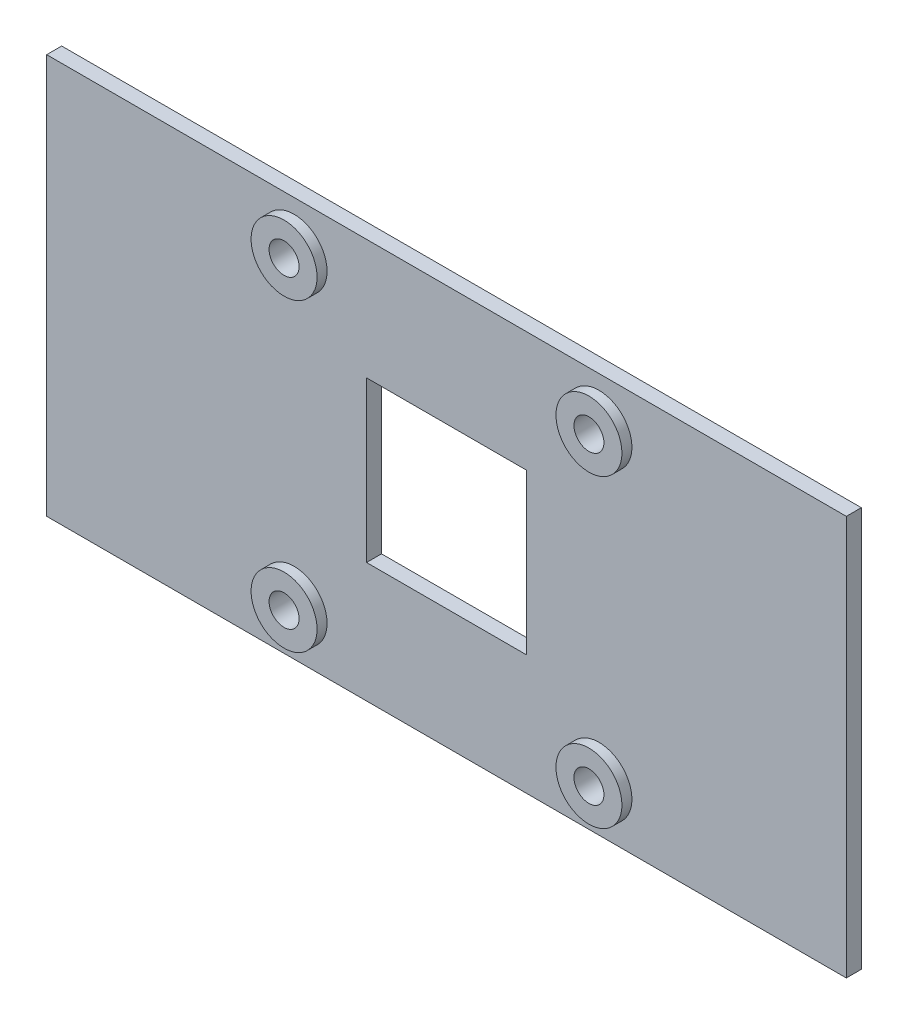
ISO-10303-21;
HEADER;
FILE_DESCRIPTION(('STEP AP214'),'2;1');
FILE_NAME('part.step','',(''),(''),'','','');
FILE_SCHEMA(('AUTOMOTIVE_DESIGN { 1 0 10303 214 1 1 1 1 }'));
ENDSEC;
DATA;
#1=APPLICATION_CONTEXT('core data for automotive mechanical design processes');
#2=APPLICATION_PROTOCOL_DEFINITION('international standard','automotive_design',2000,#1);
#3=PRODUCT_CONTEXT('',#1,'mechanical');
#4=PRODUCT('Part','Part','',(#3));
#5=PRODUCT_RELATED_PRODUCT_CATEGORY('part','',(#4));
#6=PRODUCT_DEFINITION_FORMATION('','',#4);
#7=PRODUCT_DEFINITION_CONTEXT('part definition',#1,'design');
#8=PRODUCT_DEFINITION('design','',#6,#7);
#9=PRODUCT_DEFINITION_SHAPE('','',#8);
#10=(LENGTH_UNIT() NAMED_UNIT(*) SI_UNIT(.MILLI.,.METRE.));
#11=(NAMED_UNIT(*) PLANE_ANGLE_UNIT() SI_UNIT($,.RADIAN.));
#12=(NAMED_UNIT(*) SI_UNIT($,.STERADIAN.) SOLID_ANGLE_UNIT());
#13=UNCERTAINTY_MEASURE_WITH_UNIT(LENGTH_MEASURE(1.E-05),#10,'distance_accuracy_value','');
#14=(GEOMETRIC_REPRESENTATION_CONTEXT(3) GLOBAL_UNCERTAINTY_ASSIGNED_CONTEXT((#13)) GLOBAL_UNIT_ASSIGNED_CONTEXT((#10,
#11,#12)) REPRESENTATION_CONTEXT('',''));
#15=CARTESIAN_POINT('',(0.,0.,0.));
#16=DIRECTION('',(0.,0.,1.));
#17=DIRECTION('',(1.,0.,0.));
#18=AXIS2_PLACEMENT_3D('',#15,#16,#17);
#19=CARTESIAN_POINT('',(0.,0.,1.5));
#20=DIRECTION('',(0.,0.,1.));
#21=DIRECTION('',(1.,0.,0.));
#22=AXIS2_PLACEMENT_3D('',#19,#20,#21);
#23=PLANE('',#22);
#24=CARTESIAN_POINT('',(-22.4791463831349,-14.9932103921682,1.5));
#25=DIRECTION('',(0.,0.,1.));
#26=DIRECTION('',(1.,0.,0.));
#27=AXIS2_PLACEMENT_3D('',#24,#25,#26);
#28=CIRCLE('',#27,3.3);
#29=CARTESIAN_POINT('',(-19.1791463831349,-14.9932103921682,1.5));
#30=VERTEX_POINT('',#29);
#31=EDGE_CURVE('E294',#30,#30,#28,.T.);
#32=ORIENTED_EDGE('',*,*,#31,.F.);
#33=EDGE_LOOP('',(#32));
#34=FACE_BOUND('',#33,.T.);
#35=CARTESIAN_POINT('',(-22.4791463831349,15.5067896078318,1.5));
#36=DIRECTION('',(0.,0.,1.));
#37=DIRECTION('',(1.,0.,0.));
#38=AXIS2_PLACEMENT_3D('',#35,#36,#37);
#39=CIRCLE('',#38,3.3);
#40=CARTESIAN_POINT('',(-19.1791463831349,15.5067896078318,1.5));
#41=VERTEX_POINT('',#40);
#42=EDGE_CURVE('E238',#41,#41,#39,.T.);
#43=ORIENTED_EDGE('',*,*,#42,.F.);
#44=EDGE_LOOP('',(#43));
#45=FACE_BOUND('',#44,.T.);
#46=DIRECTION('',(0.,-1.,0.));
#47=VECTOR('',#46,1.);
#48=CARTESIAN_POINT('',(-47.2291463831347,20.2567896078318,1.5));
#49=LINE('',#48,#47);
#50=CARTESIAN_POINT('',(-47.2291463831347,20.2567896078318,1.5));
#51=VERTEX_POINT('',#50);
#52=CARTESIAN_POINT('',(-47.2291463831347,-19.7432103921682,1.5));
#53=VERTEX_POINT('',#52);
#54=EDGE_CURVE('E155',#51,#53,#49,.T.);
#55=ORIENTED_EDGE('',*,*,#54,.T.);
#56=DIRECTION('',(1.,0.,0.));
#57=VECTOR('',#56,1.);
#58=CARTESIAN_POINT('',(-47.2291463831347,-19.7432103921682,1.5));
#59=LINE('',#58,#57);
#60=CARTESIAN_POINT('',(32.7708536168649,-19.7432103921682,1.5));
#61=VERTEX_POINT('',#60);
#62=EDGE_CURVE('E158',#53,#61,#59,.T.);
#63=ORIENTED_EDGE('',*,*,#62,.T.);
#64=DIRECTION('',(0.,1.,0.));
#65=VECTOR('',#64,1.);
#66=CARTESIAN_POINT('',(32.7708536168649,20.2567896078318,1.5));
#67=LINE('',#66,#65);
#68=CARTESIAN_POINT('',(32.7708536168649,20.2567896078318,1.5));
#69=VERTEX_POINT('',#68);
#70=EDGE_CURVE('E161',#61,#69,#67,.T.);
#71=ORIENTED_EDGE('',*,*,#70,.T.);
#72=DIRECTION('',(-1.,0.,0.));
#73=VECTOR('',#72,1.);
#74=CARTESIAN_POINT('',(-47.2291463831347,20.2567896078318,1.5));
#75=LINE('',#74,#73);
#76=EDGE_CURVE('E163',#69,#51,#75,.T.);
#77=ORIENTED_EDGE('',*,*,#76,.T.);
#78=EDGE_LOOP('',(#55,#63,#71,#77));
#79=FACE_BOUND('',#78,.T.);
#80=DIRECTION('',(0.,1.,0.));
#81=VECTOR('',#80,1.);
#82=CARTESIAN_POINT('',(0.770853616865096,-7.74321039216817,1.5));
#83=LINE('',#82,#81);
#84=CARTESIAN_POINT('',(0.770853616865096,-7.74321039216817,1.5));
#85=VERTEX_POINT('',#84);
#86=CARTESIAN_POINT('',(0.770853616865096,8.25678960783183,1.5));
#87=VERTEX_POINT('',#86);
#88=EDGE_CURVE('E110',#85,#87,#83,.T.);
#89=ORIENTED_EDGE('',*,*,#88,.F.);
#90=DIRECTION('',(1.,0.,0.));
#91=VECTOR('',#90,1.);
#92=CARTESIAN_POINT('',(-15.2291463831349,-7.74321039216817,1.5));
#93=LINE('',#92,#91);
#94=CARTESIAN_POINT('',(-15.2291463831349,-7.74321039216817,1.5));
#95=VERTEX_POINT('',#94);
#96=EDGE_CURVE('E102',#95,#85,#93,.T.);
#97=ORIENTED_EDGE('',*,*,#96,.F.);
#98=DIRECTION('',(0.,-1.,0.));
#99=VECTOR('',#98,1.);
#100=CARTESIAN_POINT('',(-15.2291463831349,8.25678960783183,1.5));
#101=LINE('',#100,#99);
#102=CARTESIAN_POINT('',(-15.2291463831349,8.25678960783183,1.5));
#103=VERTEX_POINT('',#102);
#104=EDGE_CURVE('E126',#103,#95,#101,.T.);
#105=ORIENTED_EDGE('',*,*,#104,.F.);
#106=DIRECTION('',(-1.,0.,0.));
#107=VECTOR('',#106,1.);
#108=CARTESIAN_POINT('',(0.770853616865096,8.25678960783183,1.5));
#109=LINE('',#108,#107);
#110=EDGE_CURVE('E124',#87,#103,#109,.T.);
#111=ORIENTED_EDGE('',*,*,#110,.F.);
#112=EDGE_LOOP('',(#89,#97,#105,#111));
#113=FACE_BOUND('',#112,.T.);
#114=CARTESIAN_POINT('',(8.02085361686509,-14.9932103921682,1.5));
#115=DIRECTION('',(0.,0.,1.));
#116=DIRECTION('',(1.,0.,0.));
#117=AXIS2_PLACEMENT_3D('',#114,#115,#116);
#118=CIRCLE('',#117,3.3);
#119=CARTESIAN_POINT('',(11.3208536168651,-14.9932103921682,1.5));
#120=VERTEX_POINT('',#119);
#121=EDGE_CURVE('E291',#120,#120,#118,.T.);
#122=ORIENTED_EDGE('',*,*,#121,.F.);
#123=EDGE_LOOP('',(#122));
#124=FACE_BOUND('',#123,.T.);
#125=CARTESIAN_POINT('',(8.02085361686509,15.5067896078318,1.5));
#126=DIRECTION('',(0.,0.,1.));
#127=DIRECTION('',(1.,0.,0.));
#128=AXIS2_PLACEMENT_3D('',#125,#126,#127);
#129=CIRCLE('',#128,3.3);
#130=CARTESIAN_POINT('',(11.3208536168651,15.5067896078318,1.5));
#131=VERTEX_POINT('',#130);
#132=EDGE_CURVE('E243',#131,#131,#129,.T.);
#133=ORIENTED_EDGE('',*,*,#132,.F.);
#134=EDGE_LOOP('',(#133));
#135=FACE_BOUND('',#134,.T.);
#136=ADVANCED_FACE('F39',(#34,#45,#79,#113,#124,#135),#23,.T.);
#137=CARTESIAN_POINT('',(0.,0.,0.));
#138=DIRECTION('',(0.,0.,1.));
#139=DIRECTION('',(1.,0.,0.));
#140=AXIS2_PLACEMENT_3D('',#137,#138,#139);
#141=PLANE('',#140);
#142=CARTESIAN_POINT('',(-22.4791463831349,-14.9932103921682,0.));
#143=DIRECTION('',(0.,0.,1.));
#144=DIRECTION('',(-1.,0.,0.));
#145=AXIS2_PLACEMENT_3D('',#142,#143,#144);
#146=CIRCLE('',#145,1.5);
#147=CARTESIAN_POINT('',(-23.9791463831349,-14.9932103921682,0.));
#148=VERTEX_POINT('',#147);
#149=EDGE_CURVE('E119',#148,#148,#146,.T.);
#150=ORIENTED_EDGE('',*,*,#149,.T.);
#151=EDGE_LOOP('',(#150));
#152=FACE_BOUND('',#151,.T.);
#153=CARTESIAN_POINT('',(8.02085361686509,-14.9932103921682,0.));
#154=DIRECTION('',(0.,0.,1.));
#155=DIRECTION('',(1.,0.,0.));
#156=AXIS2_PLACEMENT_3D('',#153,#154,#155);
#157=CIRCLE('',#156,1.5);
#158=CARTESIAN_POINT('',(9.52085361686509,-14.9932103921682,0.));
#159=VERTEX_POINT('',#158);
#160=EDGE_CURVE('E145',#159,#159,#157,.T.);
#161=ORIENTED_EDGE('',*,*,#160,.T.);
#162=EDGE_LOOP('',(#161));
#163=FACE_BOUND('',#162,.T.);
#164=CARTESIAN_POINT('',(8.02085361686509,15.5067896078318,0.));
#165=DIRECTION('',(0.,0.,1.));
#166=DIRECTION('',(-1.,0.,0.));
#167=AXIS2_PLACEMENT_3D('',#164,#165,#166);
#168=CIRCLE('',#167,1.5);
#169=CARTESIAN_POINT('',(6.52085361686509,15.5067896078318,0.));
#170=VERTEX_POINT('',#169);
#171=EDGE_CURVE('E148',#170,#170,#168,.T.);
#172=ORIENTED_EDGE('',*,*,#171,.T.);
#173=EDGE_LOOP('',(#172));
#174=FACE_BOUND('',#173,.T.);
#175=CARTESIAN_POINT('',(-22.4791463831349,15.5067896078318,0.));
#176=DIRECTION('',(0.,0.,1.));
#177=DIRECTION('',(1.,0.,0.));
#178=AXIS2_PLACEMENT_3D('',#175,#176,#177);
#179=CIRCLE('',#178,1.5);
#180=CARTESIAN_POINT('',(-20.9791463831349,15.5067896078318,0.));
#181=VERTEX_POINT('',#180);
#182=EDGE_CURVE('E151',#181,#181,#179,.T.);
#183=ORIENTED_EDGE('',*,*,#182,.T.);
#184=EDGE_LOOP('',(#183));
#185=FACE_BOUND('',#184,.T.);
#186=DIRECTION('',(0.,-1.,0.));
#187=VECTOR('',#186,1.);
#188=CARTESIAN_POINT('',(-47.2291463831347,20.2567896078318,0.));
#189=LINE('',#188,#187);
#190=CARTESIAN_POINT('',(-47.2291463831347,20.2567896078318,0.));
#191=VERTEX_POINT('',#190);
#192=CARTESIAN_POINT('',(-47.2291463831347,-19.7432103921682,0.));
#193=VERTEX_POINT('',#192);
#194=EDGE_CURVE('E154',#191,#193,#189,.T.);
#195=ORIENTED_EDGE('',*,*,#194,.F.);
#196=DIRECTION('',(-1.,0.,0.));
#197=VECTOR('',#196,1.);
#198=CARTESIAN_POINT('',(-47.2291463831347,20.2567896078318,0.));
#199=LINE('',#198,#197);
#200=CARTESIAN_POINT('',(32.7708536168649,20.2567896078318,0.));
#201=VERTEX_POINT('',#200);
#202=EDGE_CURVE('E159',#201,#191,#199,.T.);
#203=ORIENTED_EDGE('',*,*,#202,.F.);
#204=DIRECTION('',(0.,1.,0.));
#205=VECTOR('',#204,1.);
#206=CARTESIAN_POINT('',(32.7708536168649,20.2567896078318,0.));
#207=LINE('',#206,#205);
#208=CARTESIAN_POINT('',(32.7708536168649,-19.7432103921682,0.));
#209=VERTEX_POINT('',#208);
#210=EDGE_CURVE('E170',#209,#201,#207,.T.);
#211=ORIENTED_EDGE('',*,*,#210,.F.);
#212=DIRECTION('',(1.,0.,0.));
#213=VECTOR('',#212,1.);
#214=CARTESIAN_POINT('',(-47.2291463831347,-19.7432103921682,0.));
#215=LINE('',#214,#213);
#216=EDGE_CURVE('E168',#193,#209,#215,.T.);
#217=ORIENTED_EDGE('',*,*,#216,.F.);
#218=EDGE_LOOP('',(#195,#203,#211,#217));
#219=FACE_BOUND('',#218,.T.);
#220=DIRECTION('',(1.,0.,0.));
#221=VECTOR('',#220,1.);
#222=CARTESIAN_POINT('',(-7.2291463831349,-7.74321039216817,0.));
#223=LINE('',#222,#221);
#224=CARTESIAN_POINT('',(-15.2291463831349,-7.74321039216817,0.));
#225=VERTEX_POINT('',#224);
#226=CARTESIAN_POINT('',(0.770853616865096,-7.74321039216817,0.));
#227=VERTEX_POINT('',#226);
#228=EDGE_CURVE('E131',#225,#227,#223,.T.);
#229=ORIENTED_EDGE('',*,*,#228,.T.);
#230=DIRECTION('',(0.,1.,0.));
#231=VECTOR('',#230,1.);
#232=CARTESIAN_POINT('',(0.770853616865096,-7.74321039216817,0.));
#233=LINE('',#232,#231);
#234=CARTESIAN_POINT('',(0.770853616865096,8.25678960783183,0.));
#235=VERTEX_POINT('',#234);
#236=EDGE_CURVE('E117',#227,#235,#233,.T.);
#237=ORIENTED_EDGE('',*,*,#236,.T.);
#238=DIRECTION('',(-1.,0.,0.));
#239=VECTOR('',#238,1.);
#240=CARTESIAN_POINT('',(0.770853616865096,8.25678960783183,0.));
#241=LINE('',#240,#239);
#242=CARTESIAN_POINT('',(-15.2291463831349,8.25678960783183,0.));
#243=VERTEX_POINT('',#242);
#244=EDGE_CURVE('E135',#235,#243,#241,.T.);
#245=ORIENTED_EDGE('',*,*,#244,.T.);
#246=DIRECTION('',(0.,-1.,0.));
#247=VECTOR('',#246,1.);
#248=CARTESIAN_POINT('',(-15.2291463831349,8.25678960783183,0.));
#249=LINE('',#248,#247);
#250=EDGE_CURVE('E111',#243,#225,#249,.T.);
#251=ORIENTED_EDGE('',*,*,#250,.T.);
#252=EDGE_LOOP('',(#229,#237,#245,#251));
#253=FACE_BOUND('',#252,.T.);
#254=ADVANCED_FACE('F188',(#152,#163,#174,#185,#219,#253),#141,.F.);
#255=CARTESIAN_POINT('',(-47.2291463831347,20.2567896078318,1.5));
#256=DIRECTION('',(1.,0.,0.));
#257=DIRECTION('',(0.,1.,0.));
#258=AXIS2_PLACEMENT_3D('',#255,#256,#257);
#259=PLANE('',#258);
#260=ORIENTED_EDGE('',*,*,#194,.T.);
#261=DIRECTION('',(0.,0.,-1.));
#262=VECTOR('',#261,1.);
#263=CARTESIAN_POINT('',(-47.2291463831347,-19.7432103921682,1.5));
#264=LINE('',#263,#262);
#265=EDGE_CURVE('E11',#53,#193,#264,.T.);
#266=ORIENTED_EDGE('',*,*,#265,.F.);
#267=ORIENTED_EDGE('',*,*,#54,.F.);
#268=DIRECTION('',(0.,0.,-1.));
#269=VECTOR('',#268,1.);
#270=CARTESIAN_POINT('',(-47.2291463831347,20.2567896078318,1.5));
#271=LINE('',#270,#269);
#272=EDGE_CURVE('E165',#51,#191,#271,.T.);
#273=ORIENTED_EDGE('',*,*,#272,.T.);
#274=EDGE_LOOP('',(#260,#266,#267,#273));
#275=FACE_BOUND('',#274,.T.);
#276=ADVANCED_FACE('F41',(#275),#259,.F.);
#277=CARTESIAN_POINT('',(-47.2291463831347,-19.7432103921682,1.5));
#278=DIRECTION('',(0.,1.,0.));
#279=DIRECTION('',(-1.,0.,0.));
#280=AXIS2_PLACEMENT_3D('',#277,#278,#279);
#281=PLANE('',#280);
#282=ORIENTED_EDGE('',*,*,#216,.T.);
#283=DIRECTION('',(0.,0.,-1.));
#284=VECTOR('',#283,1.);
#285=CARTESIAN_POINT('',(32.7708536168649,-19.7432103921682,1.5));
#286=LINE('',#285,#284);
#287=EDGE_CURVE('E47',#61,#209,#286,.T.);
#288=ORIENTED_EDGE('',*,*,#287,.F.);
#289=ORIENTED_EDGE('',*,*,#62,.F.);
#290=ORIENTED_EDGE('',*,*,#265,.T.);
#291=EDGE_LOOP('',(#282,#288,#289,#290));
#292=FACE_BOUND('',#291,.T.);
#293=ADVANCED_FACE('F198',(#292),#281,.F.);
#294=CARTESIAN_POINT('',(32.7708536168649,20.2567896078318,1.5));
#295=DIRECTION('',(-1.,0.,0.));
#296=DIRECTION('',(0.,0.,1.));
#297=AXIS2_PLACEMENT_3D('',#294,#295,#296);
#298=PLANE('',#297);
#299=ORIENTED_EDGE('',*,*,#210,.T.);
#300=DIRECTION('',(0.,0.,-1.));
#301=VECTOR('',#300,1.);
#302=CARTESIAN_POINT('',(32.7708536168649,20.2567896078318,1.5));
#303=LINE('',#302,#301);
#304=EDGE_CURVE('E175',#69,#201,#303,.T.);
#305=ORIENTED_EDGE('',*,*,#304,.F.);
#306=ORIENTED_EDGE('',*,*,#70,.F.);
#307=ORIENTED_EDGE('',*,*,#287,.T.);
#308=EDGE_LOOP('',(#299,#305,#306,#307));
#309=FACE_BOUND('',#308,.T.);
#310=ADVANCED_FACE('F182',(#309),#298,.F.);
#311=CARTESIAN_POINT('',(-47.2291463831347,20.2567896078318,1.5));
#312=DIRECTION('',(0.,-1.,0.));
#313=DIRECTION('',(1.,0.,0.));
#314=AXIS2_PLACEMENT_3D('',#311,#312,#313);
#315=PLANE('',#314);
#316=ORIENTED_EDGE('',*,*,#202,.T.);
#317=ORIENTED_EDGE('',*,*,#272,.F.);
#318=ORIENTED_EDGE('',*,*,#76,.F.);
#319=ORIENTED_EDGE('',*,*,#304,.T.);
#320=EDGE_LOOP('',(#316,#317,#318,#319));
#321=FACE_BOUND('',#320,.T.);
#322=ADVANCED_FACE('F192',(#321),#315,.F.);
#323=CARTESIAN_POINT('',(-22.4791463831349,15.5067896078318,1.5));
#324=DIRECTION('',(0.,0.,-1.));
#325=DIRECTION('',(-1.,0.,0.));
#326=AXIS2_PLACEMENT_3D('',#323,#324,#325);
#327=CYLINDRICAL_SURFACE('',#326,1.5);
#328=ORIENTED_EDGE('',*,*,#182,.F.);
#329=EDGE_LOOP('',(#328));
#330=FACE_BOUND('',#329,.T.);
#331=CARTESIAN_POINT('',(-22.4791463831349,15.5067896078318,2.5));
#332=DIRECTION('',(0.,0.,1.));
#333=DIRECTION('',(1.,0.,0.));
#334=AXIS2_PLACEMENT_3D('',#331,#332,#333);
#335=CIRCLE('',#334,1.5);
#336=CARTESIAN_POINT('',(-20.9791463831349,15.5067896078318,2.5));
#337=VERTEX_POINT('',#336);
#338=EDGE_CURVE('E236',#337,#337,#335,.T.);
#339=ORIENTED_EDGE('',*,*,#338,.T.);
#340=EDGE_LOOP('',(#339));
#341=FACE_BOUND('',#340,.T.);
#342=ADVANCED_FACE('F218',(#330,#341),#327,.F.);
#343=CARTESIAN_POINT('',(8.02085361686509,15.5067896078318,1.5));
#344=DIRECTION('',(0.,0.,-1.));
#345=DIRECTION('',(-1.,0.,0.));
#346=AXIS2_PLACEMENT_3D('',#343,#344,#345);
#347=CYLINDRICAL_SURFACE('',#346,1.5);
#348=ORIENTED_EDGE('',*,*,#171,.F.);
#349=EDGE_LOOP('',(#348));
#350=FACE_BOUND('',#349,.T.);
#351=CARTESIAN_POINT('',(8.02085361686509,15.5067896078318,2.5));
#352=DIRECTION('',(0.,0.,1.));
#353=DIRECTION('',(1.,0.,0.));
#354=AXIS2_PLACEMENT_3D('',#351,#352,#353);
#355=CIRCLE('',#354,1.5);
#356=CARTESIAN_POINT('',(9.52085361686509,15.5067896078318,2.5));
#357=VERTEX_POINT('',#356);
#358=EDGE_CURVE('E239',#357,#357,#355,.T.);
#359=ORIENTED_EDGE('',*,*,#358,.T.);
#360=EDGE_LOOP('',(#359));
#361=FACE_BOUND('',#360,.T.);
#362=ADVANCED_FACE('F225',(#350,#361),#347,.F.);
#363=CARTESIAN_POINT('',(8.02085361686509,-14.9932103921682,1.5));
#364=DIRECTION('',(0.,0.,-1.));
#365=DIRECTION('',(-1.,0.,0.));
#366=AXIS2_PLACEMENT_3D('',#363,#364,#365);
#367=CYLINDRICAL_SURFACE('',#366,1.5);
#368=ORIENTED_EDGE('',*,*,#160,.F.);
#369=EDGE_LOOP('',(#368));
#370=FACE_BOUND('',#369,.T.);
#371=CARTESIAN_POINT('',(8.02085361686509,-14.9932103921682,2.5));
#372=DIRECTION('',(0.,0.,1.));
#373=DIRECTION('',(1.,0.,0.));
#374=AXIS2_PLACEMENT_3D('',#371,#372,#373);
#375=CIRCLE('',#374,1.5);
#376=CARTESIAN_POINT('',(9.52085361686509,-14.9932103921682,2.5));
#377=VERTEX_POINT('',#376);
#378=EDGE_CURVE('E288',#377,#377,#375,.T.);
#379=ORIENTED_EDGE('',*,*,#378,.T.);
#380=EDGE_LOOP('',(#379));
#381=FACE_BOUND('',#380,.T.);
#382=ADVANCED_FACE('F230',(#370,#381),#367,.F.);
#383=CARTESIAN_POINT('',(-22.4791463831349,-14.9932103921682,1.5));
#384=DIRECTION('',(0.,0.,-1.));
#385=DIRECTION('',(-1.,0.,0.));
#386=AXIS2_PLACEMENT_3D('',#383,#384,#385);
#387=CYLINDRICAL_SURFACE('',#386,1.5);
#388=ORIENTED_EDGE('',*,*,#149,.F.);
#389=EDGE_LOOP('',(#388));
#390=FACE_BOUND('',#389,.T.);
#391=CARTESIAN_POINT('',(-22.4791463831349,-14.9932103921682,2.5));
#392=DIRECTION('',(0.,0.,1.));
#393=DIRECTION('',(1.,0.,0.));
#394=AXIS2_PLACEMENT_3D('',#391,#392,#393);
#395=CIRCLE('',#394,1.5);
#396=CARTESIAN_POINT('',(-20.9791463831349,-14.9932103921682,2.5));
#397=VERTEX_POINT('',#396);
#398=EDGE_CURVE('E247',#397,#397,#395,.T.);
#399=ORIENTED_EDGE('',*,*,#398,.T.);
#400=EDGE_LOOP('',(#399));
#401=FACE_BOUND('',#400,.T.);
#402=ADVANCED_FACE('F276',(#390,#401),#387,.F.);
#403=CARTESIAN_POINT('',(-7.2291463831349,-7.74321039216817,1.5));
#404=DIRECTION('',(0.,1.,0.));
#405=DIRECTION('',(0.,0.,1.));
#406=AXIS2_PLACEMENT_3D('',#403,#404,#405);
#407=PLANE('',#406);
#408=ORIENTED_EDGE('',*,*,#228,.F.);
#409=DIRECTION('',(0.,0.,-1.));
#410=VECTOR('',#409,1.);
#411=CARTESIAN_POINT('',(-15.2291463831349,-7.74321039216817,1.5));
#412=LINE('',#411,#410);
#413=EDGE_CURVE('E59',#95,#225,#412,.T.);
#414=ORIENTED_EDGE('',*,*,#413,.F.);
#415=ORIENTED_EDGE('',*,*,#96,.T.);
#416=DIRECTION('',(0.,0.,-1.));
#417=VECTOR('',#416,1.);
#418=CARTESIAN_POINT('',(0.770853616865096,-7.74321039216817,1.5));
#419=LINE('',#418,#417);
#420=EDGE_CURVE('E105',#85,#227,#419,.T.);
#421=ORIENTED_EDGE('',*,*,#420,.T.);
#422=EDGE_LOOP('',(#408,#414,#415,#421));
#423=FACE_BOUND('',#422,.T.);
#424=ADVANCED_FACE('F104',(#423),#407,.T.);
#425=CARTESIAN_POINT('',(0.770853616865096,-7.74321039216817,1.5));
#426=DIRECTION('',(-1.,0.,0.));
#427=DIRECTION('',(0.,0.,1.));
#428=AXIS2_PLACEMENT_3D('',#425,#426,#427);
#429=PLANE('',#428);
#430=ORIENTED_EDGE('',*,*,#236,.F.);
#431=ORIENTED_EDGE('',*,*,#420,.F.);
#432=ORIENTED_EDGE('',*,*,#88,.T.);
#433=DIRECTION('',(0.,0.,-1.));
#434=VECTOR('',#433,1.);
#435=CARTESIAN_POINT('',(0.770853616865096,8.25678960783183,1.5));
#436=LINE('',#435,#434);
#437=EDGE_CURVE('E120',#87,#235,#436,.T.);
#438=ORIENTED_EDGE('',*,*,#437,.T.);
#439=EDGE_LOOP('',(#430,#431,#432,#438));
#440=FACE_BOUND('',#439,.T.);
#441=ADVANCED_FACE('F114',(#440),#429,.T.);
#442=CARTESIAN_POINT('',(0.770853616865096,8.25678960783183,1.5));
#443=DIRECTION('',(0.,-1.,0.));
#444=DIRECTION('',(1.,0.,0.));
#445=AXIS2_PLACEMENT_3D('',#442,#443,#444);
#446=PLANE('',#445);
#447=ORIENTED_EDGE('',*,*,#244,.F.);
#448=ORIENTED_EDGE('',*,*,#437,.F.);
#449=ORIENTED_EDGE('',*,*,#110,.T.);
#450=DIRECTION('',(0.,0.,-1.));
#451=VECTOR('',#450,1.);
#452=CARTESIAN_POINT('',(-15.2291463831349,8.25678960783183,1.5));
#453=LINE('',#452,#451);
#454=EDGE_CURVE('E54',#103,#243,#453,.T.);
#455=ORIENTED_EDGE('',*,*,#454,.T.);
#456=EDGE_LOOP('',(#447,#448,#449,#455));
#457=FACE_BOUND('',#456,.T.);
#458=ADVANCED_FACE('F269',(#457),#446,.T.);
#459=CARTESIAN_POINT('',(-15.2291463831349,8.25678960783183,1.5));
#460=DIRECTION('',(1.,0.,0.));
#461=DIRECTION('',(0.,0.,-1.));
#462=AXIS2_PLACEMENT_3D('',#459,#460,#461);
#463=PLANE('',#462);
#464=ORIENTED_EDGE('',*,*,#250,.F.);
#465=ORIENTED_EDGE('',*,*,#454,.F.);
#466=ORIENTED_EDGE('',*,*,#104,.T.);
#467=ORIENTED_EDGE('',*,*,#413,.T.);
#468=EDGE_LOOP('',(#464,#465,#466,#467));
#469=FACE_BOUND('',#468,.T.);
#470=ADVANCED_FACE('F266',(#469),#463,.T.);
#471=CARTESIAN_POINT('',(-22.4791463831349,-14.9932103921682,2.5));
#472=DIRECTION('',(0.,0.,1.));
#473=DIRECTION('',(1.,0.,0.));
#474=AXIS2_PLACEMENT_3D('',#471,#472,#473);
#475=PLANE('',#474);
#476=CARTESIAN_POINT('',(-22.4791463831349,-14.9932103921682,2.5));
#477=DIRECTION('',(0.,0.,1.));
#478=DIRECTION('',(1.,0.,0.));
#479=AXIS2_PLACEMENT_3D('',#476,#477,#478);
#480=CIRCLE('',#479,3.3);
#481=CARTESIAN_POINT('',(-19.1791463831349,-14.9932103921682,2.5));
#482=VERTEX_POINT('',#481);
#483=EDGE_CURVE('E290',#482,#482,#480,.T.);
#484=ORIENTED_EDGE('',*,*,#483,.T.);
#485=EDGE_LOOP('',(#484));
#486=FACE_BOUND('',#485,.T.);
#487=ORIENTED_EDGE('',*,*,#398,.F.);
#488=EDGE_LOOP('',(#487));
#489=FACE_BOUND('',#488,.T.);
#490=ADVANCED_FACE('F268',(#486,#489),#475,.T.);
#491=CARTESIAN_POINT('',(-22.4791463831349,-14.9932103921682,2.5));
#492=DIRECTION('',(0.,0.,-1.));
#493=DIRECTION('',(-1.,0.,0.));
#494=AXIS2_PLACEMENT_3D('',#491,#492,#493);
#495=CYLINDRICAL_SURFACE('',#494,3.3);
#496=ORIENTED_EDGE('',*,*,#483,.F.);
#497=EDGE_LOOP('',(#496));
#498=FACE_BOUND('',#497,.T.);
#499=ORIENTED_EDGE('',*,*,#31,.T.);
#500=EDGE_LOOP('',(#499));
#501=FACE_BOUND('',#500,.T.);
#502=ADVANCED_FACE('F312',(#498,#501),#495,.T.);
#503=CARTESIAN_POINT('',(8.02085361686509,-14.9932103921682,2.5));
#504=DIRECTION('',(0.,0.,1.));
#505=DIRECTION('',(1.,0.,0.));
#506=AXIS2_PLACEMENT_3D('',#503,#504,#505);
#507=PLANE('',#506);
#508=CARTESIAN_POINT('',(8.02085361686509,-14.9932103921682,2.5));
#509=DIRECTION('',(0.,0.,1.));
#510=DIRECTION('',(1.,0.,0.));
#511=AXIS2_PLACEMENT_3D('',#508,#509,#510);
#512=CIRCLE('',#511,3.3);
#513=CARTESIAN_POINT('',(11.3208536168651,-14.9932103921682,2.5));
#514=VERTEX_POINT('',#513);
#515=EDGE_CURVE('E296',#514,#514,#512,.T.);
#516=ORIENTED_EDGE('',*,*,#515,.T.);
#517=EDGE_LOOP('',(#516));
#518=FACE_BOUND('',#517,.T.);
#519=ORIENTED_EDGE('',*,*,#378,.F.);
#520=EDGE_LOOP('',(#519));
#521=FACE_BOUND('',#520,.T.);
#522=ADVANCED_FACE('F317',(#518,#521),#507,.T.);
#523=CARTESIAN_POINT('',(8.02085361686509,-14.9932103921682,2.5));
#524=DIRECTION('',(0.,0.,-1.));
#525=DIRECTION('',(-1.,0.,0.));
#526=AXIS2_PLACEMENT_3D('',#523,#524,#525);
#527=CYLINDRICAL_SURFACE('',#526,3.3);
#528=ORIENTED_EDGE('',*,*,#515,.F.);
#529=EDGE_LOOP('',(#528));
#530=FACE_BOUND('',#529,.T.);
#531=ORIENTED_EDGE('',*,*,#121,.T.);
#532=EDGE_LOOP('',(#531));
#533=FACE_BOUND('',#532,.T.);
#534=ADVANCED_FACE('F324',(#530,#533),#527,.T.);
#535=CARTESIAN_POINT('',(8.02085361686509,15.5067896078318,2.5));
#536=DIRECTION('',(0.,0.,1.));
#537=DIRECTION('',(1.,0.,0.));
#538=AXIS2_PLACEMENT_3D('',#535,#536,#537);
#539=PLANE('',#538);
#540=CARTESIAN_POINT('',(8.02085361686509,15.5067896078318,2.5));
#541=DIRECTION('',(0.,0.,1.));
#542=DIRECTION('',(1.,0.,0.));
#543=AXIS2_PLACEMENT_3D('',#540,#541,#542);
#544=CIRCLE('',#543,3.3);
#545=CARTESIAN_POINT('',(11.3208536168651,15.5067896078318,2.5));
#546=VERTEX_POINT('',#545);
#547=EDGE_CURVE('E302',#546,#546,#544,.T.);
#548=ORIENTED_EDGE('',*,*,#547,.T.);
#549=EDGE_LOOP('',(#548));
#550=FACE_BOUND('',#549,.T.);
#551=ORIENTED_EDGE('',*,*,#358,.F.);
#552=EDGE_LOOP('',(#551));
#553=FACE_BOUND('',#552,.T.);
#554=ADVANCED_FACE('F321',(#550,#553),#539,.T.);
#555=CARTESIAN_POINT('',(8.02085361686509,15.5067896078318,2.5));
#556=DIRECTION('',(0.,0.,-1.));
#557=DIRECTION('',(-1.,0.,0.));
#558=AXIS2_PLACEMENT_3D('',#555,#556,#557);
#559=CYLINDRICAL_SURFACE('',#558,3.3);
#560=ORIENTED_EDGE('',*,*,#547,.F.);
#561=EDGE_LOOP('',(#560));
#562=FACE_BOUND('',#561,.T.);
#563=ORIENTED_EDGE('',*,*,#132,.T.);
#564=EDGE_LOOP('',(#563));
#565=FACE_BOUND('',#564,.T.);
#566=ADVANCED_FACE('F262',(#562,#565),#559,.T.);
#567=CARTESIAN_POINT('',(-22.4791463831349,15.5067896078318,2.5));
#568=DIRECTION('',(0.,0.,1.));
#569=DIRECTION('',(1.,0.,0.));
#570=AXIS2_PLACEMENT_3D('',#567,#568,#569);
#571=PLANE('',#570);
#572=CARTESIAN_POINT('',(-22.4791463831349,15.5067896078318,2.5));
#573=DIRECTION('',(0.,0.,1.));
#574=DIRECTION('',(1.,0.,0.));
#575=AXIS2_PLACEMENT_3D('',#572,#573,#574);
#576=CIRCLE('',#575,3.3);
#577=CARTESIAN_POINT('',(-19.1791463831349,15.5067896078318,2.5));
#578=VERTEX_POINT('',#577);
#579=EDGE_CURVE('E133',#578,#578,#576,.T.);
#580=ORIENTED_EDGE('',*,*,#579,.T.);
#581=EDGE_LOOP('',(#580));
#582=FACE_BOUND('',#581,.T.);
#583=ORIENTED_EDGE('',*,*,#338,.F.);
#584=EDGE_LOOP('',(#583));
#585=FACE_BOUND('',#584,.T.);
#586=ADVANCED_FACE('F252',(#582,#585),#571,.T.);
#587=CARTESIAN_POINT('',(-22.4791463831349,15.5067896078318,2.5));
#588=DIRECTION('',(0.,0.,-1.));
#589=DIRECTION('',(-1.,0.,0.));
#590=AXIS2_PLACEMENT_3D('',#587,#588,#589);
#591=CYLINDRICAL_SURFACE('',#590,3.3);
#592=ORIENTED_EDGE('',*,*,#579,.F.);
#593=EDGE_LOOP('',(#592));
#594=FACE_BOUND('',#593,.T.);
#595=ORIENTED_EDGE('',*,*,#42,.T.);
#596=EDGE_LOOP('',(#595));
#597=FACE_BOUND('',#596,.T.);
#598=ADVANCED_FACE('F254',(#594,#597),#591,.T.);
#599=CLOSED_SHELL('',(#136,#254,#276,#293,#310,#322,#342,#362,#382,#402,#424,#441,#458,#470,
#490,#502,#522,#534,#554,#566,#586,#598));
#600=MANIFOLD_SOLID_BREP('B2',#599);
#601=ADVANCED_BREP_SHAPE_REPRESENTATION('',(#18,#600),#14);
#602=SHAPE_DEFINITION_REPRESENTATION(#9,#601);
ENDSEC;
END-ISO-10303-21;
